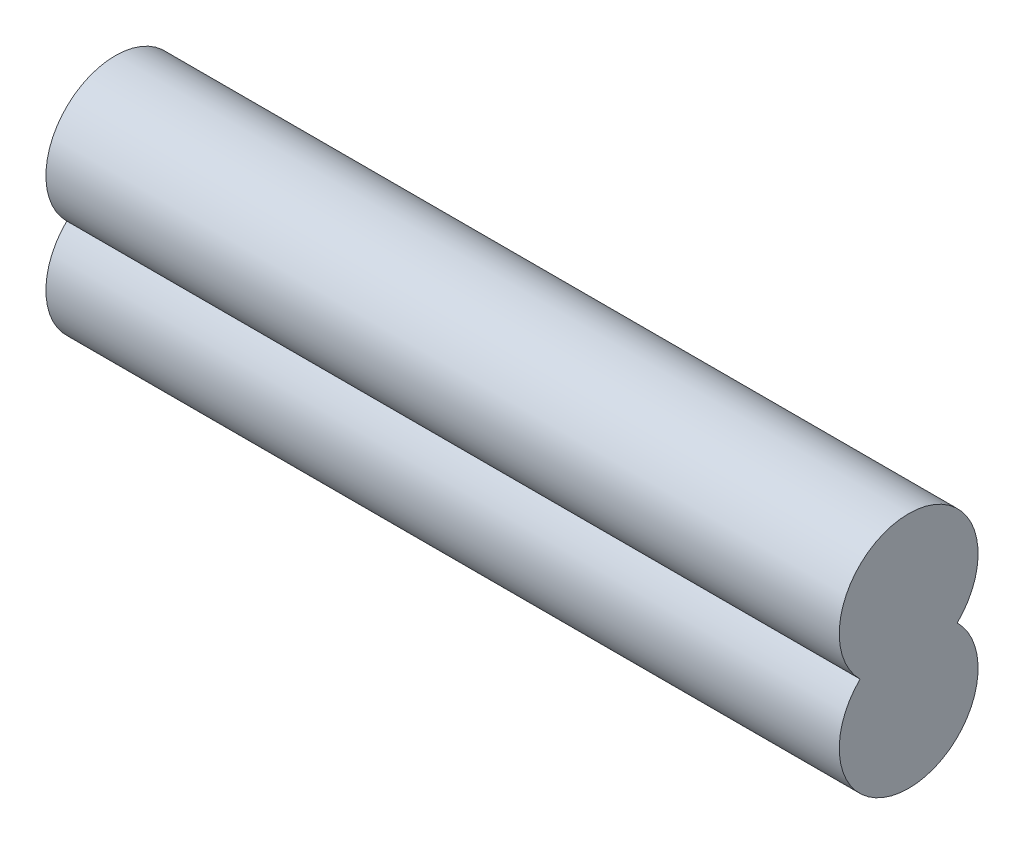
ISO-10303-21;
HEADER;
FILE_DESCRIPTION(('STEP AP214'),'2;1');
FILE_NAME('part.step','',(''),(''),'','','');
FILE_SCHEMA(('AUTOMOTIVE_DESIGN { 1 0 10303 214 1 1 1 1 }'));
ENDSEC;
DATA;
#1=APPLICATION_CONTEXT('core data for automotive mechanical design processes');
#2=APPLICATION_PROTOCOL_DEFINITION('international standard','automotive_design',2000,#1);
#3=PRODUCT_CONTEXT('',#1,'mechanical');
#4=PRODUCT('Part','Part','',(#3));
#5=PRODUCT_RELATED_PRODUCT_CATEGORY('part','',(#4));
#6=PRODUCT_DEFINITION_FORMATION('','',#4);
#7=PRODUCT_DEFINITION_CONTEXT('part definition',#1,'design');
#8=PRODUCT_DEFINITION('design','',#6,#7);
#9=PRODUCT_DEFINITION_SHAPE('','',#8);
#10=(LENGTH_UNIT() NAMED_UNIT(*) SI_UNIT(.MILLI.,.METRE.));
#11=(NAMED_UNIT(*) PLANE_ANGLE_UNIT() SI_UNIT($,.RADIAN.));
#12=(NAMED_UNIT(*) SI_UNIT($,.STERADIAN.) SOLID_ANGLE_UNIT());
#13=UNCERTAINTY_MEASURE_WITH_UNIT(LENGTH_MEASURE(1.E-05),#10,'distance_accuracy_value','');
#14=(GEOMETRIC_REPRESENTATION_CONTEXT(3) GLOBAL_UNCERTAINTY_ASSIGNED_CONTEXT((#13)) GLOBAL_UNIT_ASSIGNED_CONTEXT((#10,
#11,#12)) REPRESENTATION_CONTEXT('',''));
#15=CARTESIAN_POINT('',(0.,0.,0.));
#16=DIRECTION('',(0.,0.,1.));
#17=DIRECTION('',(1.,0.,0.));
#18=AXIS2_PLACEMENT_3D('',#15,#16,#17);
#19=CARTESIAN_POINT('',(0.,0.,0.));
#20=DIRECTION('',(-1.,0.,0.));
#21=DIRECTION('',(0.,0.,1.));
#22=AXIS2_PLACEMENT_3D('',#19,#20,#21);
#23=PLANE('',#22);
#24=CARTESIAN_POINT('',(0.,-2.54,0.));
#25=DIRECTION('',(-1.,0.,0.));
#26=DIRECTION('',(0.,0.,1.));
#27=AXIS2_PLACEMENT_3D('',#24,#25,#26);
#28=CIRCLE('',#27,3.556);
#29=CARTESIAN_POINT('',(0.,0.,-2.48868157866771));
#30=VERTEX_POINT('',#29);
#31=CARTESIAN_POINT('',(0.,0.,2.48868157866771));
#32=VERTEX_POINT('',#31);
#33=EDGE_CURVE('E57',#30,#32,#28,.T.);
#34=ORIENTED_EDGE('',*,*,#33,.T.);
#35=CARTESIAN_POINT('',(0.,2.54,0.));
#36=DIRECTION('',(-1.,0.,0.));
#37=DIRECTION('',(0.,0.,1.));
#38=AXIS2_PLACEMENT_3D('',#35,#36,#37);
#39=CIRCLE('',#38,3.556);
#40=EDGE_CURVE('E51',#32,#30,#39,.T.);
#41=ORIENTED_EDGE('',*,*,#40,.T.);
#42=EDGE_LOOP('',(#34,#41));
#43=FACE_BOUND('',#42,.T.);
#44=ADVANCED_FACE('F32',(#43),#23,.T.);
#45=CARTESIAN_POINT('',(40.64,2.54,0.));
#46=DIRECTION('',(-1.,0.,0.));
#47=DIRECTION('',(0.,0.,1.));
#48=AXIS2_PLACEMENT_3D('',#45,#46,#47);
#49=CYLINDRICAL_SURFACE('',#48,3.556);
#50=ORIENTED_EDGE('',*,*,#40,.F.);
#51=DIRECTION('',(-1.,0.,0.));
#52=VECTOR('',#51,1.);
#53=CARTESIAN_POINT('',(40.64,0.,2.48868157866771));
#54=LINE('',#53,#52);
#55=CARTESIAN_POINT('',(40.64,0.,2.48868157866771));
#56=VERTEX_POINT('',#55);
#57=EDGE_CURVE('E35',#56,#32,#54,.T.);
#58=ORIENTED_EDGE('',*,*,#57,.F.);
#59=CARTESIAN_POINT('',(40.64,2.54,0.));
#60=DIRECTION('',(-1.,0.,0.));
#61=DIRECTION('',(0.,0.,1.));
#62=AXIS2_PLACEMENT_3D('',#59,#60,#61);
#63=CIRCLE('',#62,3.556);
#64=CARTESIAN_POINT('',(40.64,0.,-2.48868157866771));
#65=VERTEX_POINT('',#64);
#66=EDGE_CURVE('E60',#56,#65,#63,.T.);
#67=ORIENTED_EDGE('',*,*,#66,.T.);
#68=DIRECTION('',(-1.,0.,0.));
#69=VECTOR('',#68,1.);
#70=CARTESIAN_POINT('',(40.64,0.,-2.48868157866771));
#71=LINE('',#70,#69);
#72=EDGE_CURVE('E11',#65,#30,#71,.T.);
#73=ORIENTED_EDGE('',*,*,#72,.T.);
#74=EDGE_LOOP('',(#50,#58,#67,#73));
#75=FACE_BOUND('',#74,.T.);
#76=ADVANCED_FACE('F62',(#75),#49,.T.);
#77=CARTESIAN_POINT('',(40.64,-2.54,0.));
#78=DIRECTION('',(-1.,0.,0.));
#79=DIRECTION('',(0.,0.,1.));
#80=AXIS2_PLACEMENT_3D('',#77,#78,#79);
#81=CYLINDRICAL_SURFACE('',#80,3.556);
#82=ORIENTED_EDGE('',*,*,#33,.F.);
#83=ORIENTED_EDGE('',*,*,#72,.F.);
#84=CARTESIAN_POINT('',(40.64,-2.54,0.));
#85=DIRECTION('',(-1.,0.,0.));
#86=DIRECTION('',(0.,0.,1.));
#87=AXIS2_PLACEMENT_3D('',#84,#85,#86);
#88=CIRCLE('',#87,3.556);
#89=EDGE_CURVE('E67',#65,#56,#88,.T.);
#90=ORIENTED_EDGE('',*,*,#89,.T.);
#91=ORIENTED_EDGE('',*,*,#57,.T.);
#92=EDGE_LOOP('',(#82,#83,#90,#91));
#93=FACE_BOUND('',#92,.T.);
#94=ADVANCED_FACE('F58',(#93),#81,.T.);
#95=CARTESIAN_POINT('',(40.64,0.,0.));
#96=DIRECTION('',(-1.,0.,0.));
#97=DIRECTION('',(0.,0.,1.));
#98=AXIS2_PLACEMENT_3D('',#95,#96,#97);
#99=PLANE('',#98);
#100=ORIENTED_EDGE('',*,*,#66,.F.);
#101=ORIENTED_EDGE('',*,*,#89,.F.);
#102=EDGE_LOOP('',(#100,#101));
#103=FACE_BOUND('',#102,.T.);
#104=ADVANCED_FACE('F70',(#103),#99,.F.);
#105=CLOSED_SHELL('',(#44,#76,#94,#104));
#106=MANIFOLD_SOLID_BREP('B2',#105);
#107=ADVANCED_BREP_SHAPE_REPRESENTATION('',(#18,#106),#14);
#108=SHAPE_DEFINITION_REPRESENTATION(#9,#107);
ENDSEC;
END-ISO-10303-21;
